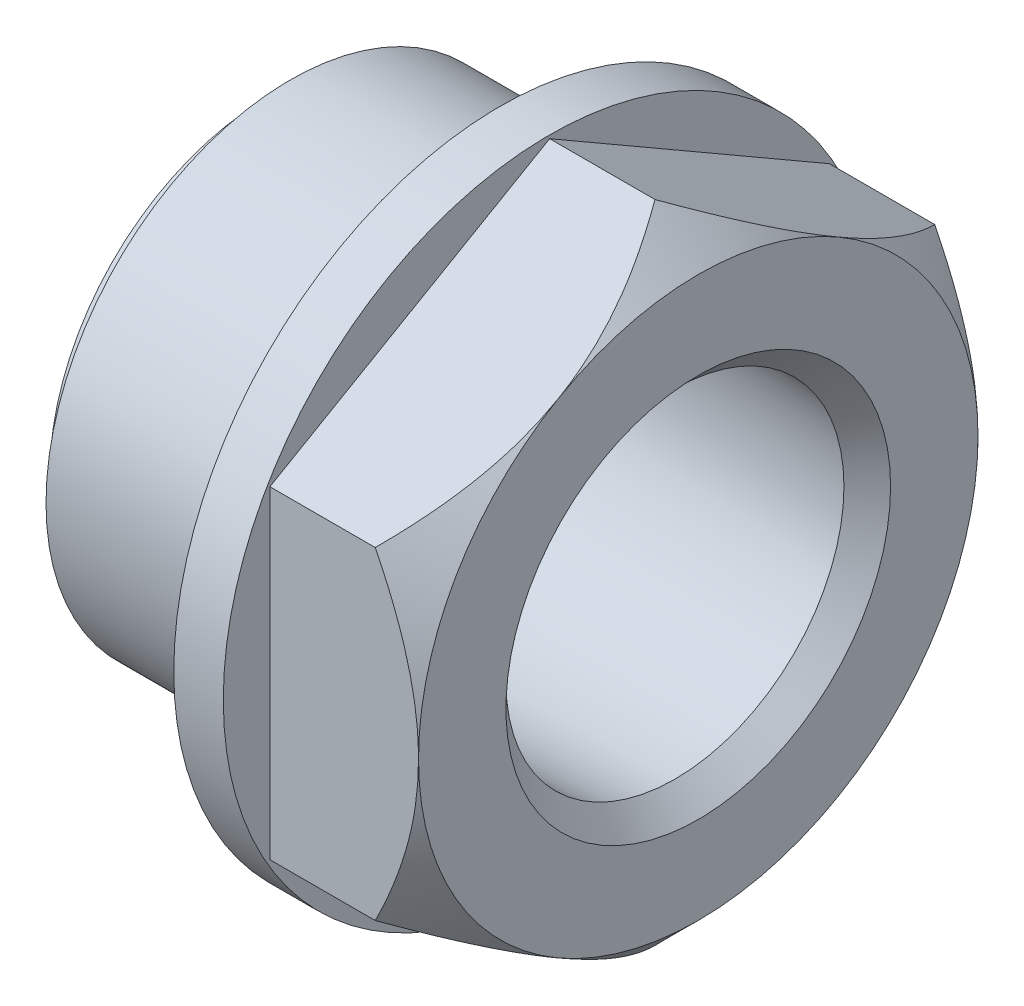
ISO-10303-21;
HEADER;
FILE_DESCRIPTION(('STEP AP214'),'2;1');
FILE_NAME('part.step','',(''),(''),'','','');
FILE_SCHEMA(('AUTOMOTIVE_DESIGN { 1 0 10303 214 1 1 1 1 }'));
ENDSEC;
DATA;
#1=APPLICATION_CONTEXT('core data for automotive mechanical design processes');
#2=APPLICATION_PROTOCOL_DEFINITION('international standard','automotive_design',2000,#1);
#3=PRODUCT_CONTEXT('',#1,'mechanical');
#4=PRODUCT('Part','Part','',(#3));
#5=PRODUCT_RELATED_PRODUCT_CATEGORY('part','',(#4));
#6=PRODUCT_DEFINITION_FORMATION('','',#4);
#7=PRODUCT_DEFINITION_CONTEXT('part definition',#1,'design');
#8=PRODUCT_DEFINITION('design','',#6,#7);
#9=PRODUCT_DEFINITION_SHAPE('','',#8);
#10=(LENGTH_UNIT() NAMED_UNIT(*) SI_UNIT(.MILLI.,.METRE.));
#11=(NAMED_UNIT(*) PLANE_ANGLE_UNIT() SI_UNIT($,.RADIAN.));
#12=(NAMED_UNIT(*) SI_UNIT($,.STERADIAN.) SOLID_ANGLE_UNIT());
#13=UNCERTAINTY_MEASURE_WITH_UNIT(LENGTH_MEASURE(1.E-05),#10,'distance_accuracy_value','');
#14=(GEOMETRIC_REPRESENTATION_CONTEXT(3) GLOBAL_UNCERTAINTY_ASSIGNED_CONTEXT((#13)) GLOBAL_UNIT_ASSIGNED_CONTEXT((#10,
#11,#12)) REPRESENTATION_CONTEXT('',''));
#15=CARTESIAN_POINT('',(0.,0.,0.));
#16=DIRECTION('',(0.,0.,1.));
#17=DIRECTION('',(1.,0.,0.));
#18=AXIS2_PLACEMENT_3D('',#15,#16,#17);
#19=CARTESIAN_POINT('',(10.,13.146,0.));
#20=DIRECTION('',(-1.,0.,0.));
#21=DIRECTION('',(0.,0.,1.));
#22=AXIS2_PLACEMENT_3D('',#19,#20,#21);
#23=PLANE('',#22);
#24=CARTESIAN_POINT('',(10.,0.,0.));
#25=DIRECTION('',(-1.,0.,0.));
#26=DIRECTION('',(0.,0.,1.));
#27=AXIS2_PLACEMENT_3D('',#24,#25,#26);
#28=CIRCLE('',#27,12.292);
#29=CARTESIAN_POINT('',(10.,0.,12.292));
#30=VERTEX_POINT('',#29);
#31=EDGE_CURVE('E378',#30,#30,#28,.T.);
#32=ORIENTED_EDGE('',*,*,#31,.F.);
#33=EDGE_LOOP('',(#32));
#34=FACE_BOUND('',#33,.T.);
#35=CARTESIAN_POINT('',(10.,0.,0.));
#36=DIRECTION('',(-1.,0.,0.));
#37=DIRECTION('',(0.,0.,1.));
#38=AXIS2_PLACEMENT_3D('',#35,#36,#37);
#39=CIRCLE('',#38,14.);
#40=CARTESIAN_POINT('',(10.,0.,14.));
#41=VERTEX_POINT('',#40);
#42=EDGE_CURVE('E19',#41,#41,#39,.F.);
#43=ORIENTED_EDGE('',*,*,#42,.F.);
#44=EDGE_LOOP('',(#43));
#45=FACE_BOUND('',#44,.T.);
#46=ADVANCED_FACE('F16',(#34,#45),#23,.T.);
#47=CARTESIAN_POINT('',(13.25,0.,0.));
#48=DIRECTION('',(-1.,0.,0.));
#49=DIRECTION('',(0.,0.,1.));
#50=AXIS2_PLACEMENT_3D('',#47,#48,#49);
#51=CYLINDRICAL_SURFACE('',#50,14.);
#52=CARTESIAN_POINT('',(12.125,0.,0.));
#53=DIRECTION('',(-1.,0.,0.));
#54=DIRECTION('',(0.,0.,1.));
#55=AXIS2_PLACEMENT_3D('',#52,#53,#54);
#56=CIRCLE('',#55,14.);
#57=CARTESIAN_POINT('',(12.125,0.,14.));
#58=VERTEX_POINT('',#57);
#59=EDGE_CURVE('E376',#58,#58,#56,.F.);
#60=ORIENTED_EDGE('',*,*,#59,.F.);
#61=EDGE_LOOP('',(#60));
#62=FACE_BOUND('',#61,.T.);
#63=ORIENTED_EDGE('',*,*,#42,.T.);
#64=EDGE_LOOP('',(#63));
#65=FACE_BOUND('',#64,.T.);
#66=ADVANCED_FACE('F318',(#62,#65),#51,.T.);
#67=CARTESIAN_POINT('',(9.5,0.,0.));
#68=DIRECTION('',(-1.,0.,0.));
#69=DIRECTION('',(0.,0.,1.));
#70=AXIS2_PLACEMENT_3D('',#67,#68,#69);
#71=CYLINDRICAL_SURFACE('',#70,12.292);
#72=ORIENTED_EDGE('',*,*,#31,.T.);
#73=EDGE_LOOP('',(#72));
#74=FACE_BOUND('',#73,.T.);
#75=CARTESIAN_POINT('',(9.,0.,0.));
#76=DIRECTION('',(-1.,0.,0.));
#77=DIRECTION('',(0.,0.,1.));
#78=AXIS2_PLACEMENT_3D('',#75,#76,#77);
#79=CIRCLE('',#78,12.292);
#80=CARTESIAN_POINT('',(9.,0.,12.292));
#81=VERTEX_POINT('',#80);
#82=EDGE_CURVE('E146',#81,#81,#79,.T.);
#83=ORIENTED_EDGE('',*,*,#82,.F.);
#84=EDGE_LOOP('',(#83));
#85=FACE_BOUND('',#84,.T.);
#86=ADVANCED_FACE('F316',(#74,#85),#71,.T.);
#87=CARTESIAN_POINT('',(12.125,0.,0.));
#88=DIRECTION('',(1.,0.,0.));
#89=DIRECTION('',(0.,0.,-1.));
#90=AXIS2_PLACEMENT_3D('',#87,#88,#89);
#91=PLANE('',#90);
#92=DIRECTION('',(0.,1.,0.));
#93=VECTOR('',#92,1.);
#94=CARTESIAN_POINT('',(12.125,-6.92820323027551,12.));
#95=LINE('',#94,#93);
#96=CARTESIAN_POINT('',(12.125,-6.92820323027548,12.));
#97=VERTEX_POINT('',#96);
#98=CARTESIAN_POINT('',(12.125,6.92820323027551,12.));
#99=VERTEX_POINT('',#98);
#100=EDGE_CURVE('E135',#97,#99,#95,.T.);
#101=ORIENTED_EDGE('',*,*,#100,.T.);
#102=DIRECTION('',(0.,0.5,-0.866025403784439));
#103=VECTOR('',#102,1.);
#104=CARTESIAN_POINT('',(12.125,6.92820323027551,12.));
#105=LINE('',#104,#103);
#106=CARTESIAN_POINT('',(12.125,13.856406460551,0.));
#107=VERTEX_POINT('',#106);
#108=EDGE_CURVE('E102',#99,#107,#105,.T.);
#109=ORIENTED_EDGE('',*,*,#108,.T.);
#110=DIRECTION('',(0.,-0.500000000000001,-0.866025403784438));
#111=VECTOR('',#110,1.);
#112=CARTESIAN_POINT('',(12.125,14.4337567297407,1.));
#113=LINE('',#112,#111);
#114=CARTESIAN_POINT('',(12.125,6.92820323027551,-12.));
#115=VERTEX_POINT('',#114);
#116=EDGE_CURVE('E96',#107,#115,#113,.T.);
#117=ORIENTED_EDGE('',*,*,#116,.T.);
#118=DIRECTION('',(0.,1.,0.));
#119=VECTOR('',#118,1.);
#120=CARTESIAN_POINT('',(12.125,6.9282032302755,-12.));
#121=LINE('',#120,#119);
#122=CARTESIAN_POINT('',(12.125,-6.9282032302755,-12.));
#123=VERTEX_POINT('',#122);
#124=EDGE_CURVE('E101',#115,#123,#121,.F.);
#125=ORIENTED_EDGE('',*,*,#124,.T.);
#126=DIRECTION('',(0.,-0.5,0.866025403784439));
#127=VECTOR('',#126,1.);
#128=CARTESIAN_POINT('',(12.125,-6.9282032302755,-12.));
#129=LINE('',#128,#127);
#130=CARTESIAN_POINT('',(12.125,-13.856406460551,0.));
#131=VERTEX_POINT('',#130);
#132=EDGE_CURVE('E125',#123,#131,#129,.T.);
#133=ORIENTED_EDGE('',*,*,#132,.T.);
#134=DIRECTION('',(0.,0.5,0.866025403784439));
#135=VECTOR('',#134,1.);
#136=CARTESIAN_POINT('',(12.125,-14.4337567297406,-1.));
#137=LINE('',#136,#135);
#138=EDGE_CURVE('E130',#131,#97,#137,.T.);
#139=ORIENTED_EDGE('',*,*,#138,.T.);
#140=EDGE_LOOP('',(#101,#109,#117,#125,#133,#139));
#141=FACE_BOUND('',#140,.T.);
#142=ORIENTED_EDGE('',*,*,#59,.T.);
#143=EDGE_LOOP('',(#142));
#144=FACE_BOUND('',#143,.T.);
#145=ADVANCED_FACE('F98',(#141,#144),#91,.T.);
#146=CARTESIAN_POINT('',(9.,11.386,0.));
#147=DIRECTION('',(-1.,0.,0.));
#148=DIRECTION('',(0.,0.,1.));
#149=AXIS2_PLACEMENT_3D('',#146,#147,#148);
#150=PLANE('',#149);
#151=CARTESIAN_POINT('',(9.,0.,0.));
#152=DIRECTION('',(-1.,0.,0.));
#153=DIRECTION('',(0.,0.,1.));
#154=AXIS2_PLACEMENT_3D('',#151,#152,#153);
#155=CIRCLE('',#154,10.48);
#156=CARTESIAN_POINT('',(9.,0.,10.48));
#157=VERTEX_POINT('',#156);
#158=EDGE_CURVE('E364',#157,#157,#155,.T.);
#159=ORIENTED_EDGE('',*,*,#158,.F.);
#160=EDGE_LOOP('',(#159));
#161=FACE_BOUND('',#160,.T.);
#162=ORIENTED_EDGE('',*,*,#82,.T.);
#163=EDGE_LOOP('',(#162));
#164=FACE_BOUND('',#163,.T.);
#165=ADVANCED_FACE('F308',(#161,#164),#150,.T.);
#166=CARTESIAN_POINT('',(24.875,6.92820323027551,12.));
#167=DIRECTION('',(0.,-0.866025403784439,-0.5));
#168=DIRECTION('',(0.,0.5,-0.866025403784439));
#169=AXIS2_PLACEMENT_3D('',#166,#167,#168);
#170=PLANE('',#169);
#171=ORIENTED_EDGE('',*,*,#108,.F.);
#172=DIRECTION('',(-1.,0.,0.));
#173=VECTOR('',#172,1.);
#174=CARTESIAN_POINT('',(24.875,6.92820323027551,12.));
#175=LINE('',#174,#173);
#176=CARTESIAN_POINT('',(16.6435935359117,6.92820322673824,12.0000000061267));
#177=VERTEX_POINT('',#176);
#178=EDGE_CURVE('E133',#99,#177,#175,.F.);
#179=ORIENTED_EDGE('',*,*,#178,.T.);
#180=CARTESIAN_POINT('',(18.5,10.3923048454133,5.99999999999998));
#181=CARTESIAN_POINT('',(18.5000214012147,10.3001580482508,6.15960293444011));
#182=CARTESIAN_POINT('',(18.4957550520564,10.2080149027244,6.31919954406104));
#183=CARTESIAN_POINT('',(18.4788058166658,10.0239363279119,6.63803298822126));
#184=CARTESIAN_POINT('',(18.4661242544,9.93200086823313,6.79726987540201));
#185=CARTESIAN_POINT('',(18.4325329546137,9.74866992467553,7.11480838424332));
#186=CARTESIAN_POINT('',(18.4116376909631,9.65727377645075,7.27311115658474));
#187=CARTESIAN_POINT('',(18.3619199018999,9.47502603821456,7.58877349877432));
#188=CARTESIAN_POINT('',(18.3330971567225,9.38417446337112,7.74613304235081));
#189=CARTESIAN_POINT('',(18.2362673040509,9.11539646301031,8.2116701949325));
#190=CARTESIAN_POINT('',(18.1573597256669,8.93843123531564,8.51818296047266));
#191=CARTESIAN_POINT('',(17.9736695418297,8.58789265376202,9.12533359373665));
#192=CARTESIAN_POINT('',(17.8688788326135,8.41432038060701,9.42596958962637));
#193=CARTESIAN_POINT('',(17.6773863708097,8.13044417336836,9.91765760362367));
#194=CARTESIAN_POINT('',(17.5969985929983,8.01905764515047,10.1105847297758));
#195=CARTESIAN_POINT('',(17.4278289845295,7.79791723652669,10.4936111531187));
#196=CARTESIAN_POINT('',(17.3390489243437,7.68816301739123,10.6837110370063));
#197=CARTESIAN_POINT('',(17.1530787276864,7.46911823894365,11.0631077224102));
#198=CARTESIAN_POINT('',(17.0558111215107,7.35984420893125,11.2523758943395));
#199=CARTESIAN_POINT('',(16.8545394181464,7.14286473622993,11.6281953652577));
#200=CARTESIAN_POINT('',(16.7505357696065,7.03515918965747,11.8147468441782));
#201=CARTESIAN_POINT('',(16.6435935333097,6.92820322413621,12.0000000106336));
#202=B_SPLINE_CURVE_WITH_KNOTS('',3,(#180,#181,#182,#183,#184,#185,#186,#187,#188,#189,#190,
#191,#192,#193,#194,#195,#196,#197,#198,#199,#200,#201),.UNSPECIFIED.,.F.,.F.,(4,2,2,2,2,2,2,2,
2,2,4),(0.,0.552819302485784,1.10555165045821,1.65731432981182,2.20909230661315,
3.29573306208976,4.38271446670579,5.09304904233947,5.80323409578149,6.52076262349193,
7.23824340983378),.UNSPECIFIED.);
#203=CARTESIAN_POINT('',(18.5,10.3923048454133,5.99999999999999));
#204=VERTEX_POINT('',#203);
#205=EDGE_CURVE('E262',#204,#177,#202,.T.);
#206=ORIENTED_EDGE('',*,*,#205,.F.);
#207=CARTESIAN_POINT('',(16.643593518941,13.8564064377386,-2.17519626082027E-08));
#208=CARTESIAN_POINT('',(16.7634443813126,13.7365345526683,0.207624212841111));
#209=CARTESIAN_POINT('',(16.8796150892258,13.6157176463444,0.416885249118554));
#210=CARTESIAN_POINT('',(17.1034212288145,13.3720429935528,0.838942140075366));
#211=CARTESIAN_POINT('',(17.2110517116932,13.2491841129759,1.0517399590779));
#212=CARTESIAN_POINT('',(17.4171049957558,13.0006364623115,1.48223711494745));
#213=CARTESIAN_POINT('',(17.5154658994841,12.8749347868178,1.6999588046682));
#214=CARTESIAN_POINT('',(17.7007499981217,12.6214559537171,2.13899702309646));
#215=CARTESIAN_POINT('',(17.7876752252215,12.4936791694162,2.36031290521922));
#216=CARTESIAN_POINT('',(17.9462537780236,12.239803596543,2.80003829601357));
#217=CARTESIAN_POINT('',(18.0182750128793,12.1137625632583,3.01834776958145));
#218=CARTESIAN_POINT('',(18.1486623778504,11.8599300114785,3.45799864593772));
#219=CARTESIAN_POINT('',(18.2070300881805,11.7321386973692,3.67933969471948));
#220=CARTESIAN_POINT('',(18.308634703979,11.4754170878705,4.1239945657564));
#221=CARTESIAN_POINT('',(18.3519126802403,11.3464908789797,4.34730130998816));
#222=CARTESIAN_POINT('',(18.4224240056902,11.0875704661716,4.79576462009273));
#223=CARTESIAN_POINT('',(18.4496624834315,10.9575766171215,5.02092057131725));
#224=CARTESIAN_POINT('',(18.4789525109781,10.75506120507,5.37168755430549));
#225=CARTESIAN_POINT('',(18.4868188774119,10.6827399677421,5.49695161182387));
#226=CARTESIAN_POINT('',(18.4973561715047,10.5377162176319,5.74814011531919));
#227=CARTESIAN_POINT('',(18.5000063965541,10.4650133293052,5.87406521175815));
#228=CARTESIAN_POINT('',(18.5,10.3923048454133,5.99999999999998));
#229=B_SPLINE_CURVE_WITH_KNOTS('',3,(#207,#208,#209,#210,#211,#212,#213,#214,#215,#216,#217,
#218,#219,#220,#221,#222,#223,#224,#225,#226,#227,#228),.UNSPECIFIED.,.F.,.F.,(4,2,2,2,2,2,2,2,
2,2,4),(0.,0.804132064481402,1.60872674645307,2.41836120867867,3.22785159893361,
4.01401465428508,4.80008667660401,5.58400217660222,6.36766688707782,6.8021509964881,
7.23835610217239),.UNSPECIFIED.);
#230=CARTESIAN_POINT('',(16.6435935571344,13.8564064428656,-3.06321939377383E-08));
#231=VERTEX_POINT('',#230);
#232=EDGE_CURVE('E292',#231,#204,#229,.T.);
#233=ORIENTED_EDGE('',*,*,#232,.F.);
#234=DIRECTION('',(1.,0.,0.));
#235=VECTOR('',#234,1.);
#236=CARTESIAN_POINT('',(24.875,13.856406460551,0.));
#237=LINE('',#236,#235);
#238=EDGE_CURVE('E106',#231,#107,#237,.F.);
#239=ORIENTED_EDGE('',*,*,#238,.T.);
#240=EDGE_LOOP('',(#171,#179,#206,#233,#239));
#241=FACE_BOUND('',#240,.T.);
#242=ADVANCED_FACE('F304',(#241),#170,.F.);
#243=CARTESIAN_POINT('',(24.875,-6.92820323027551,12.));
#244=DIRECTION('',(0.,0.,-1.));
#245=DIRECTION('',(-1.,0.,0.));
#246=AXIS2_PLACEMENT_3D('',#243,#244,#245);
#247=PLANE('',#246);
#248=CARTESIAN_POINT('',(16.6435935748203,6.9282031595329,12.));
#249=CARTESIAN_POINT('',(16.7634444263458,6.68845935337836,12.));
#250=CARTESIAN_POINT('',(16.8796151285448,6.44682552723826,12.));
#251=CARTESIAN_POINT('',(17.1034212613102,5.95947621450836,12.));
#252=CARTESIAN_POINT('',(17.2110517430797,5.7137584597102,12.));
#253=CARTESIAN_POINT('',(17.4171050238102,5.21666316581342,12.));
#254=CARTESIAN_POINT('',(17.5154659253059,4.96525981586815,12.));
#255=CARTESIAN_POINT('',(17.7007500198982,4.45830215331546,12.));
#256=CARTESIAN_POINT('',(17.7876752451868,4.20274858732039,12.));
#257=CARTESIAN_POINT('',(17.9462537945568,3.69499744617505,12.));
#258=CARTESIAN_POINT('',(18.0182750277774,3.44291538160406,12.));
#259=CARTESIAN_POINT('',(18.1486623896603,2.93525028223017,12.));
#260=CARTESIAN_POINT('',(18.207030098537,2.67966765619882,12.));
#261=CARTESIAN_POINT('',(18.3086347116278,2.16622444165359,12.));
#262=CARTESIAN_POINT('',(18.3519126866352,1.90837202613705,12.));
#263=CARTESIAN_POINT('',(18.4224240098301,1.39053120514956,12.));
#264=CARTESIAN_POINT('',(18.449662486571,1.13054350941333,12.));
#265=CARTESIAN_POINT('',(18.4789525125091,0.725512692919886,12.));
#266=CARTESIAN_POINT('',(18.4868188783724,0.580870223497004,12.));
#267=CARTESIAN_POINT('',(18.4973561716977,0.290822733818333,12.));
#268=CARTESIAN_POINT('',(18.5000063965529,0.145416962473827,12.));
#269=CARTESIAN_POINT('',(18.5,0.,12.));
#270=B_SPLINE_CURVE_WITH_KNOTS('',3,(#248,#249,#250,#251,#252,#253,#254,#255,#256,#257,#258,
#259,#260,#261,#262,#263,#264,#265,#266,#267,#268,#269),.UNSPECIFIED.,.F.,.F.,(4,2,2,2,2,2,2,2,
2,2,4),(0.,0.804132055819267,1.60872672937668,2.41836118335988,3.22785156526581,
4.01401461329934,4.80008662831576,5.58400212098438,6.36766682411132,6.80215091776213,
7.23835600752121),.UNSPECIFIED.);
#271=CARTESIAN_POINT('',(18.5,0.,12.));
#272=VERTEX_POINT('',#271);
#273=EDGE_CURVE('E286',#177,#272,#270,.T.);
#274=ORIENTED_EDGE('',*,*,#273,.F.);
#275=ORIENTED_EDGE('',*,*,#178,.F.);
#276=ORIENTED_EDGE('',*,*,#100,.F.);
#277=DIRECTION('',(1.,0.,0.));
#278=VECTOR('',#277,1.);
#279=CARTESIAN_POINT('',(24.875,-6.92820323027548,12.));
#280=LINE('',#279,#278);
#281=CARTESIAN_POINT('',(16.6435935359117,-6.92820323735002,12.));
#282=VERTEX_POINT('',#281);
#283=EDGE_CURVE('E128',#97,#282,#280,.T.);
#284=ORIENTED_EDGE('',*,*,#283,.T.);
#285=CARTESIAN_POINT('',(18.5,0.,12.));
#286=CARTESIAN_POINT('',(18.5000214012147,-0.184293594325128,12.));
#287=CARTESIAN_POINT('',(18.4957550520564,-0.368579885378118,12.));
#288=CARTESIAN_POINT('',(18.4788058166658,-0.736737035003639,12.));
#289=CARTESIAN_POINT('',(18.4661242543999,-0.920607954361286,12.));
#290=CARTESIAN_POINT('',(18.4325329546136,-1.28726984147684,12.));
#291=CARTESIAN_POINT('',(18.4116376909629,-1.47006213792657,12.));
#292=CARTESIAN_POINT('',(18.3619199018996,-1.83455761439924,12.));
#293=CARTESIAN_POINT('',(18.3330971567221,-2.01626076408628,12.));
#294=CARTESIAN_POINT('',(18.2362673040505,-2.55381676480765,12.));
#295=CARTESIAN_POINT('',(18.1573597256666,-2.9077472201966,12.));
#296=CARTESIAN_POINT('',(17.9736695418295,-3.60882438330312,12.));
#297=CARTESIAN_POINT('',(17.8688788326134,-3.95596892961282,12.));
#298=CARTESIAN_POINT('',(17.6773863707546,-4.52372134425315,12.));
#299=CARTESIAN_POINT('',(17.5969985928813,-4.74649440084991,12.));
#300=CARTESIAN_POINT('',(17.427828984277,-5.18877521841475,12.));
#301=CARTESIAN_POINT('',(17.3390489240178,-5.40828365684198,12.));
#302=CARTESIAN_POINT('',(17.1530787272024,-5.84637321404879,12.));
#303=CARTESIAN_POINT('',(17.0558111209419,-6.06492127422886,12.));
#304=CARTESIAN_POINT('',(16.8545394174,-6.49888021993755,12.));
#305=CARTESIAN_POINT('',(16.7505357687673,-6.71429131323325,12.));
#306=CARTESIAN_POINT('',(16.6435935323745,-6.92820324442457,12.));
#307=B_SPLINE_CURVE_WITH_KNOTS('',3,(#285,#286,#287,#288,#289,#290,#291,#292,#293,#294,#295,
#296,#297,#298,#299,#300,#301,#302,#303,#304,#305,#306),.UNSPECIFIED.,.F.,.F.,(4,2,2,2,2,2,2,2,
2,2,4),(0.,0.552819302486391,1.10555165045942,1.65731432981351,2.20909230661531,
3.29573306209073,4.3827144667058,5.09304904285643,5.80323409681548,6.52076262505471,
7.23824341192472),.UNSPECIFIED.);
#308=EDGE_CURVE('E261',#272,#282,#307,.T.);
#309=ORIENTED_EDGE('',*,*,#308,.F.);
#310=EDGE_LOOP('',(#274,#275,#276,#284,#309));
#311=FACE_BOUND('',#310,.T.);
#312=ADVANCED_FACE('F248',(#311),#247,.F.);
#313=CARTESIAN_POINT('',(24.875,-14.4337567297406,-1.));
#314=DIRECTION('',(0.,0.866025403784439,-0.5));
#315=DIRECTION('',(0.,0.5,0.866025403784439));
#316=AXIS2_PLACEMENT_3D('',#313,#314,#315);
#317=PLANE('',#316);
#318=CARTESIAN_POINT('',(18.5,-10.3923048454132,5.99999999999996));
#319=CARTESIAN_POINT('',(18.5000214012147,-10.4844516425758,5.84039706555966));
#320=CARTESIAN_POINT('',(18.4957550520565,-10.5765947881023,5.68080045593855));
#321=CARTESIAN_POINT('',(18.4788058166658,-10.7606733629151,5.36196701177799));
#322=CARTESIAN_POINT('',(18.4661242543999,-10.8526088225939,5.20273012459706));
#323=CARTESIAN_POINT('',(18.4325329546136,-11.0359397661517,4.88519161575545));
#324=CARTESIAN_POINT('',(18.411637690963,-11.1273359143765,4.72688884341389));
#325=CARTESIAN_POINT('',(18.3619199018996,-11.3095836526129,4.41122650122404));
#326=CARTESIAN_POINT('',(18.3330971567222,-11.4004352274564,4.25386695764742));
#327=CARTESIAN_POINT('',(18.2362673040505,-11.6692132278171,3.78832980506595));
#328=CARTESIAN_POINT('',(18.1573597256666,-11.8461784555115,3.48181703952612));
#329=CARTESIAN_POINT('',(17.9736695418296,-12.1967170370648,2.87466640626276));
#330=CARTESIAN_POINT('',(17.8688788326134,-12.3702893102197,2.57403041037333));
#331=CARTESIAN_POINT('',(17.6773863707547,-12.6541655175398,2.08234239623485));
#332=CARTESIAN_POINT('',(17.5969985928813,-12.7655520458382,1.88941526994334));
#333=CARTESIAN_POINT('',(17.4278289842771,-12.9866924546206,1.50638884632564));
#334=CARTESIAN_POINT('',(17.3390489240179,-13.0964466738342,1.31628896230261));
#335=CARTESIAN_POINT('',(17.1530787272024,-13.3154914524376,0.936892276628837));
#336=CARTESIAN_POINT('',(17.0558111209419,-13.4247654825277,0.747624104565091));
#337=CARTESIAN_POINT('',(16.8545394174,-13.641744955382,0.371804633381848));
#338=CARTESIAN_POINT('',(16.7505357687673,-13.7494505020299,0.185253154330798));
#339=CARTESIAN_POINT('',(16.6435935323745,-13.8564064676255,-1.22534716911657E-08));
#340=B_SPLINE_CURVE_WITH_KNOTS('',3,(#318,#319,#320,#321,#322,#323,#324,#325,#326,#327,#328,
#329,#330,#331,#332,#333,#334,#335,#336,#337,#338,#339),.UNSPECIFIED.,.F.,.F.,(4,2,2,2,2,2,2,2,
2,2,4),(0.,0.55281930248639,1.10555165045942,1.65731432981351,2.20909230661531,3.29573306209073,
4.38271446670579,5.09304904285642,5.80323409681547,6.52076262505469,7.23824341192471),.UNSPECIFIED.);
#341=CARTESIAN_POINT('',(18.5,-10.3923048454133,5.99999999999997));
#342=VERTEX_POINT('',#341);
#343=CARTESIAN_POINT('',(16.6435935359117,-13.8564064640883,-6.12673527107802E-09));
#344=VERTEX_POINT('',#343);
#345=EDGE_CURVE('E229',#342,#344,#340,.T.);
#346=ORIENTED_EDGE('',*,*,#345,.F.);
#347=CARTESIAN_POINT('',(16.6435935748203,-6.92820326564678,11.9999999387351));
#348=CARTESIAN_POINT('',(16.7634444263458,-7.04807516872405,11.7923757122053));
#349=CARTESIAN_POINT('',(16.8796151285449,-7.1688920817941,11.5831146803543));
#350=CARTESIAN_POINT('',(17.1034212613103,-7.41256673815905,11.1610577950133));
#351=CARTESIAN_POINT('',(17.2110517430797,-7.53542561555813,10.9482599771973));
#352=CARTESIAN_POINT('',(17.4171050238102,-7.78397326250652,10.517762824581));
#353=CARTESIAN_POINT('',(17.5154659253059,-7.90967493747916,10.3000411369318));
#354=CARTESIAN_POINT('',(17.7007500198982,-8.1631537687555,9.86100292251803));
#355=CARTESIAN_POINT('',(17.7876752451869,-8.29093055175303,9.63968704233861));
#356=CARTESIAN_POINT('',(17.9462537945568,-8.54480612232571,9.1999616553062));
#357=CARTESIAN_POINT('',(18.0182750277774,-8.6708471546112,8.9816521835493));
#358=CARTESIAN_POINT('',(18.1486623896604,-8.92467970429815,8.54200131087675));
#359=CARTESIAN_POINT('',(18.2070300985371,-9.05247101731382,8.32066026396766));
#360=CARTESIAN_POINT('',(18.3086347116279,-9.30919262458644,7.87600539677075));
#361=CARTESIAN_POINT('',(18.3519126866352,-9.43811883234471,7.65269865450625));
#362=CARTESIAN_POINT('',(18.4224240098302,-9.69703924283846,7.20423534841449));
#363=CARTESIAN_POINT('',(18.449662486571,-9.82703309070657,6.97907939923554));
#364=CARTESIAN_POINT('',(18.4789525125092,-10.0295484989533,6.62831242283665));
#365=CARTESIAN_POINT('',(18.4868188783724,-10.1018697336647,6.50304836985032));
#366=CARTESIAN_POINT('',(18.4973561716977,-10.2468934785041,6.25185987548468));
#367=CARTESIAN_POINT('',(18.500006396553,-10.3195963641763,6.12593478364347));
#368=CARTESIAN_POINT('',(18.5,-10.3923048454132,5.99999999999996));
#369=B_SPLINE_CURVE_WITH_KNOTS('',3,(#347,#348,#349,#350,#351,#352,#353,#354,#355,#356,#357,
#358,#359,#360,#361,#362,#363,#364,#365,#366,#367,#368),.UNSPECIFIED.,.F.,.F.,(4,2,2,2,2,2,2,2,
2,2,4),(0.,0.804132055819271,1.60872672937668,2.41836118335989,3.22785156526582,
4.01401461329935,4.80008662831578,5.58400212098439,6.36766682411134,6.80215091776216,
7.23835600752125),.UNSPECIFIED.);
#370=EDGE_CURVE('E255',#282,#342,#369,.T.);
#371=ORIENTED_EDGE('',*,*,#370,.F.);
#372=ORIENTED_EDGE('',*,*,#283,.F.);
#373=ORIENTED_EDGE('',*,*,#138,.F.);
#374=DIRECTION('',(1.,0.,0.));
#375=VECTOR('',#374,1.);
#376=CARTESIAN_POINT('',(24.875,-13.856406460551,0.));
#377=LINE('',#376,#375);
#378=EDGE_CURVE('E121',#131,#344,#377,.T.);
#379=ORIENTED_EDGE('',*,*,#378,.T.);
#380=EDGE_LOOP('',(#346,#371,#372,#373,#379));
#381=FACE_BOUND('',#380,.T.);
#382=ADVANCED_FACE('F243',(#381),#317,.F.);
#383=CARTESIAN_POINT('',(24.875,-6.9282032302755,-12.));
#384=DIRECTION('',(0.,0.866025403784439,0.5));
#385=DIRECTION('',(0.,-0.5,0.866025403784439));
#386=AXIS2_PLACEMENT_3D('',#383,#384,#385);
#387=PLANE('',#386);
#388=CARTESIAN_POINT('',(16.6435935748203,-13.8564064251797,-6.12648886899775E-08));
#389=CARTESIAN_POINT('',(16.7634444263458,-13.7365345221024,-0.207624287794692));
#390=CARTESIAN_POINT('',(16.8796151285449,-13.6157176090324,-0.416885319645657));
#391=CARTESIAN_POINT('',(17.1034212613102,-13.3720429526674,-0.838942204986638));
#392=CARTESIAN_POINT('',(17.2110517430797,-13.2491840752684,-1.05174002280272));
#393=CARTESIAN_POINT('',(17.4171050238102,-13.00063642832,-1.48223717541902));
#394=CARTESIAN_POINT('',(17.5154659253059,-12.8749347533473,-1.69995886306813));
#395=CARTESIAN_POINT('',(17.7007500198982,-12.621455922071,-2.13899707748195));
#396=CARTESIAN_POINT('',(17.7876752451868,-12.4936791390735,-2.36031295766137));
#397=CARTESIAN_POINT('',(17.9462537945568,-12.2398035685008,-2.80003834469378));
#398=CARTESIAN_POINT('',(18.0182750277774,-12.1137625362153,-3.01834781645068));
#399=CARTESIAN_POINT('',(18.1486623896603,-11.8599299865283,-3.45799868912323));
#400=CARTESIAN_POINT('',(18.207030098537,-11.7321386735127,-3.67933973603231));
#401=CARTESIAN_POINT('',(18.3086347116278,-11.4754170662401,-4.12399460322922));
#402=CARTESIAN_POINT('',(18.3519126866352,-11.3464908584818,-4.34730134549373));
#403=CARTESIAN_POINT('',(18.4224240098301,-11.087570447988,-4.79576465158549));
#404=CARTESIAN_POINT('',(18.449662486571,-10.9575766001199,-5.02092060076444));
#405=CARTESIAN_POINT('',(18.4789525125091,-10.7550611918732,-5.37168757716331));
#406=CARTESIAN_POINT('',(18.4868188783724,-10.6827399571618,-5.49695163014964));
#407=CARTESIAN_POINT('',(18.4973561716977,-10.5377162123224,-5.74814012451527));
#408=CARTESIAN_POINT('',(18.5000063965529,-10.4650133266502,-5.87406521635648));
#409=CARTESIAN_POINT('',(18.5,-10.3923048454133,-5.99999999999998));
#410=B_SPLINE_CURVE_WITH_KNOTS('',3,(#388,#389,#390,#391,#392,#393,#394,#395,#396,#397,#398,
#399,#400,#401,#402,#403,#404,#405,#406,#407,#408,#409),.UNSPECIFIED.,.F.,.F.,(4,2,2,2,2,2,2,2,
2,2,4),(0.,0.80413205581927,1.60872672937668,2.41836118335988,3.22785156526581,4.01401461329934,
4.80008662831576,5.58400212098438,6.36766682411133,6.80215091776212,7.23835600752119),.UNSPECIFIED.);
#411=CARTESIAN_POINT('',(18.5,-10.3923048454133,-5.99999999999999));
#412=VERTEX_POINT('',#411);
#413=EDGE_CURVE('E237',#344,#412,#410,.T.);
#414=ORIENTED_EDGE('',*,*,#413,.F.);
#415=ORIENTED_EDGE('',*,*,#378,.F.);
#416=ORIENTED_EDGE('',*,*,#132,.F.);
#417=DIRECTION('',(1.,0.,0.));
#418=VECTOR('',#417,1.);
#419=CARTESIAN_POINT('',(24.875,-6.9282032302755,-12.));
#420=LINE('',#419,#418);
#421=CARTESIAN_POINT('',(16.6435935359117,-6.92820322673823,-12.0000000061267));
#422=VERTEX_POINT('',#421);
#423=EDGE_CURVE('E110',#123,#422,#420,.T.);
#424=ORIENTED_EDGE('',*,*,#423,.T.);
#425=CARTESIAN_POINT('',(18.5,-10.3923048454133,-5.99999999999998));
#426=CARTESIAN_POINT('',(18.5000214012147,-10.3001580482508,-6.15960293444011));
#427=CARTESIAN_POINT('',(18.4957550520565,-10.2080149027244,-6.31919954406103));
#428=CARTESIAN_POINT('',(18.4788058166659,-10.0239363279118,-6.63803298822125));
#429=CARTESIAN_POINT('',(18.4661242544,-9.93200086823313,-6.797269875402));
#430=CARTESIAN_POINT('',(18.4325329546137,-9.74866992467553,-7.11480838424331));
#431=CARTESIAN_POINT('',(18.4116376909631,-9.65727377645074,-7.27311115658473));
#432=CARTESIAN_POINT('',(18.3619199018999,-9.47502603821456,-7.58877349877431));
#433=CARTESIAN_POINT('',(18.3330971567225,-9.38417446337112,-7.7461330423508));
#434=CARTESIAN_POINT('',(18.2362673040509,-9.11539646301031,-8.21167019493249));
#435=CARTESIAN_POINT('',(18.1573597256669,-8.93843123531564,-8.51818296047266));
#436=CARTESIAN_POINT('',(17.9736695418297,-8.58789265376202,-9.12533359373665));
#437=CARTESIAN_POINT('',(17.8688788326135,-8.414320380607,-9.42596958962636));
#438=CARTESIAN_POINT('',(17.6773863708097,-8.13044417336835,-9.91765760362366));
#439=CARTESIAN_POINT('',(17.5969985929983,-8.01905764515046,-10.1105847297758));
#440=CARTESIAN_POINT('',(17.4278289845295,-7.79791723652668,-10.4936111531187));
#441=CARTESIAN_POINT('',(17.3390489243437,-7.68816301739122,-10.6837110370063));
#442=CARTESIAN_POINT('',(17.1530787276864,-7.46911823894364,-11.0631077224102));
#443=CARTESIAN_POINT('',(17.0558111215107,-7.35984420893124,-11.2523758943395));
#444=CARTESIAN_POINT('',(16.8545394181464,-7.14286473622992,-11.6281953652577));
#445=CARTESIAN_POINT('',(16.7505357696065,-7.03515918965746,-11.8147468441782));
#446=CARTESIAN_POINT('',(16.6435935333097,-6.9282032241362,-12.0000000106336));
#447=B_SPLINE_CURVE_WITH_KNOTS('',3,(#425,#426,#427,#428,#429,#430,#431,#432,#433,#434,#435,
#436,#437,#438,#439,#440,#441,#442,#443,#444,#445,#446),.UNSPECIFIED.,.F.,.F.,(4,2,2,2,2,2,2,2,
2,2,4),(0.,0.552819302485784,1.10555165045821,1.65731432981182,2.20909230661314,
3.29573306208975,4.38271446670579,5.09304904233947,5.80323409578149,6.52076262349193,
7.23824340983379),.UNSPECIFIED.);
#448=EDGE_CURVE('E217',#412,#422,#447,.T.);
#449=ORIENTED_EDGE('',*,*,#448,.F.);
#450=EDGE_LOOP('',(#414,#415,#416,#424,#449));
#451=FACE_BOUND('',#450,.T.);
#452=ADVANCED_FACE('F247',(#451),#387,.F.);
#453=CARTESIAN_POINT('',(24.875,14.4337567297407,1.));
#454=DIRECTION('',(0.,-0.866025403784438,0.500000000000001));
#455=DIRECTION('',(0.,-0.500000000000001,-0.866025403784438));
#456=AXIS2_PLACEMENT_3D('',#453,#454,#455);
#457=PLANE('',#456);
#458=DIRECTION('',(1.,0.,0.));
#459=VECTOR('',#458,1.);
#460=CARTESIAN_POINT('',(24.875,6.9282032302755,-12.));
#461=LINE('',#460,#459);
#462=CARTESIAN_POINT('',(16.6435935359117,6.92820323735004,-12.));
#463=VERTEX_POINT('',#462);
#464=EDGE_CURVE('E73',#463,#115,#461,.F.);
#465=ORIENTED_EDGE('',*,*,#464,.T.);
#466=ORIENTED_EDGE('',*,*,#116,.F.);
#467=ORIENTED_EDGE('',*,*,#238,.F.);
#468=CARTESIAN_POINT('',(18.5,10.3923048454133,-6.00000000000001));
#469=CARTESIAN_POINT('',(18.5000214012146,10.4844516425713,-5.84039706556766));
#470=CARTESIAN_POINT('',(18.4957550520568,10.5765947880932,-5.68080045595451));
#471=CARTESIAN_POINT('',(18.4788058166679,10.7606733628968,-5.36196701180975));
#472=CARTESIAN_POINT('',(18.4661242544032,10.8526088225711,-5.2027301246367));
#473=CARTESIAN_POINT('',(18.43253295462,11.0359397661208,-4.88519161580905));
#474=CARTESIAN_POINT('',(18.4116376909712,11.1273359143421,-4.7268888434736));
#475=CARTESIAN_POINT('',(18.361919901912,11.3095836525715,-4.41122650129587));
#476=CARTESIAN_POINT('',(18.3330971567369,11.4004352274115,-4.25386695772525));
#477=CARTESIAN_POINT('',(18.2362673040674,11.6692132277778,-3.78832980513406));
#478=CARTESIAN_POINT('',(18.1573597256813,11.8461784554812,-3.48181703957883));
#479=CARTESIAN_POINT('',(17.9736695418379,12.1967170370509,-2.87466640628703));
#480=CARTESIAN_POINT('',(17.8688788326177,12.3702893102133,-2.57403041038452));
#481=CARTESIAN_POINT('',(17.6773863732545,12.6541655138339,-2.0823424026539));
#482=CARTESIAN_POINT('',(17.5969985981922,12.7655520384791,-1.88941528268981));
#483=CARTESIAN_POINT('',(17.4278289957332,12.9866924400614,-1.50638887154312));
#484=CARTESIAN_POINT('',(17.3390489388081,13.096446655728,-1.3162889936637));
#485=CARTESIAN_POINT('',(17.1530787491676,13.3154914272591,-0.936892320239483));
#486=CARTESIAN_POINT('',(17.0558111467555,13.4247654538256,-0.747624154278707));
#487=CARTESIAN_POINT('',(16.854539451275,13.6417449197349,-0.371804695124624));
#488=CARTESIAN_POINT('',(16.7505358068551,13.7494504629612,-0.185253221999877));
#489=CARTESIAN_POINT('',(16.6435935748199,13.8564064251801,-6.12643476534286E-08));
#490=B_SPLINE_CURVE_WITH_KNOTS('',3,(#468,#469,#470,#471,#472,#473,#474,#475,#476,#477,#478,
#479,#480,#481,#482,#483,#484,#485,#486,#487,#488,#489),.UNSPECIFIED.,.F.,.F.,(4,2,2,2,2,2,2,2,
2,2,4),(0.,0.552819302458855,1.10555165040447,1.65731432973696,2.20909230651706,
3.29573306204644,4.38271446670577,5.09304901939457,5.80323404988757,6.52076255412738,
7.23824331702619),.UNSPECIFIED.);
#491=CARTESIAN_POINT('',(18.5,10.3923048454133,-6.00000000000001));
#492=VERTEX_POINT('',#491);
#493=EDGE_CURVE('E298',#492,#231,#490,.T.);
#494=ORIENTED_EDGE('',*,*,#493,.F.);
#495=CARTESIAN_POINT('',(16.6435935748203,6.92820326564684,-11.9999999387351));
#496=CARTESIAN_POINT('',(16.7634444263458,7.04807516872411,-11.7923757122053));
#497=CARTESIAN_POINT('',(16.8796151285448,7.16889208179417,-11.5831146803543));
#498=CARTESIAN_POINT('',(17.1034212613102,7.41256673815912,-11.1610577950134));
#499=CARTESIAN_POINT('',(17.2110517430797,7.5354256155582,-10.9482599771973));
#500=CARTESIAN_POINT('',(17.4171050238102,7.78397326250659,-10.517762824581));
#501=CARTESIAN_POINT('',(17.5154659253059,7.90967493747922,-10.3000411369319));
#502=CARTESIAN_POINT('',(17.7007500198982,8.16315376875557,-9.86100292251806));
#503=CARTESIAN_POINT('',(17.7876752451868,8.2909305517531,-9.63968704233864));
#504=CARTESIAN_POINT('',(17.9462537945567,8.54480612232577,-9.19996165530623));
#505=CARTESIAN_POINT('',(18.0182750277774,8.67084715461126,-8.98165218354933));
#506=CARTESIAN_POINT('',(18.1486623896603,8.92467970429821,-8.54200131087678));
#507=CARTESIAN_POINT('',(18.207030098537,9.05247101731389,-8.3206602639677));
#508=CARTESIAN_POINT('',(18.3086347116278,9.3091926245865,-7.87600539677079));
#509=CARTESIAN_POINT('',(18.3519126866352,9.43811883234477,-7.65269865450629));
#510=CARTESIAN_POINT('',(18.4224240098301,9.69703924283851,-7.20423534841453));
#511=CARTESIAN_POINT('',(18.4496624865709,9.82703309070663,-6.97907939923558));
#512=CARTESIAN_POINT('',(18.4789525125091,10.0295484989534,-6.6283124228367));
#513=CARTESIAN_POINT('',(18.4868188783723,10.1018697336648,-6.50304836985037));
#514=CARTESIAN_POINT('',(18.4973561716977,10.2468934785041,-6.25185987548473));
#515=CARTESIAN_POINT('',(18.5000063965529,10.3195963641764,-6.12593478364352));
#516=CARTESIAN_POINT('',(18.5,10.3923048454133,-6.00000000000001));
#517=B_SPLINE_CURVE_WITH_KNOTS('',3,(#495,#496,#497,#498,#499,#500,#501,#502,#503,#504,#505,
#506,#507,#508,#509,#510,#511,#512,#513,#514,#515,#516),.UNSPECIFIED.,.F.,.F.,(4,2,2,2,2,2,2,2,
2,2,4),(0.,0.804132055819266,1.60872672937667,2.41836118335988,3.22785156526581,
4.01401461329933,4.80008662831575,5.58400212098436,6.36766682411131,6.80215091776212,
7.23835600752121),.UNSPECIFIED.);
#518=EDGE_CURVE('E66',#463,#492,#517,.T.);
#519=ORIENTED_EDGE('',*,*,#518,.F.);
#520=EDGE_LOOP('',(#465,#466,#467,#494,#519));
#521=FACE_BOUND('',#520,.T.);
#522=ADVANCED_FACE('F112',(#521),#457,.F.);
#523=CARTESIAN_POINT('',(24.875,6.9282032302755,-12.));
#524=DIRECTION('',(0.,0.,1.));
#525=DIRECTION('',(1.,0.,0.));
#526=AXIS2_PLACEMENT_3D('',#523,#524,#525);
#527=PLANE('',#526);
#528=CARTESIAN_POINT('',(16.6435935748203,-6.92820315953289,-12.));
#529=CARTESIAN_POINT('',(16.7634444263458,-6.68845935337835,-12.));
#530=CARTESIAN_POINT('',(16.8796151285448,-6.44682552723825,-12.));
#531=CARTESIAN_POINT('',(17.1034212613102,-5.95947621450835,-12.));
#532=CARTESIAN_POINT('',(17.2110517430797,-5.71375845971019,-12.));
#533=CARTESIAN_POINT('',(17.4171050238102,-5.21666316581341,-12.));
#534=CARTESIAN_POINT('',(17.5154659253059,-4.96525981586814,-12.));
#535=CARTESIAN_POINT('',(17.7007500198982,-4.45830215331545,-12.));
#536=CARTESIAN_POINT('',(17.7876752451868,-4.20274858732038,-12.));
#537=CARTESIAN_POINT('',(17.9462537945568,-3.69499744617504,-12.));
#538=CARTESIAN_POINT('',(18.0182750277774,-3.44291538160406,-12.));
#539=CARTESIAN_POINT('',(18.1486623896603,-2.93525028223016,-12.));
#540=CARTESIAN_POINT('',(18.207030098537,-2.67966765619881,-12.));
#541=CARTESIAN_POINT('',(18.3086347116278,-2.16622444165358,-12.));
#542=CARTESIAN_POINT('',(18.3519126866352,-1.90837202613705,-12.));
#543=CARTESIAN_POINT('',(18.4224240098301,-1.39053120514955,-12.));
#544=CARTESIAN_POINT('',(18.449662486571,-1.13054350941333,-12.));
#545=CARTESIAN_POINT('',(18.4789525125091,-0.725512692919881,-12.));
#546=CARTESIAN_POINT('',(18.4868188783724,-0.580870223497,-12.));
#547=CARTESIAN_POINT('',(18.4973561716977,-0.290822733818332,-12.));
#548=CARTESIAN_POINT('',(18.5000063965529,-0.145416962473826,-12.));
#549=CARTESIAN_POINT('',(18.5,0.,-12.));
#550=B_SPLINE_CURVE_WITH_KNOTS('',3,(#528,#529,#530,#531,#532,#533,#534,#535,#536,#537,#538,
#539,#540,#541,#542,#543,#544,#545,#546,#547,#548,#549),.UNSPECIFIED.,.F.,.F.,(4,2,2,2,2,2,2,2,
2,2,4),(0.,0.804132055819268,1.60872672937668,2.41836118335988,3.22785156526581,
4.01401461329934,4.80008662831576,5.58400212098438,6.36766682411132,6.80215091776212,
7.2383560075212),.UNSPECIFIED.);
#551=CARTESIAN_POINT('',(18.5,0.,-12.));
#552=VERTEX_POINT('',#551);
#553=EDGE_CURVE('E34',#422,#552,#550,.T.);
#554=ORIENTED_EDGE('',*,*,#553,.F.);
#555=ORIENTED_EDGE('',*,*,#423,.F.);
#556=ORIENTED_EDGE('',*,*,#124,.F.);
#557=ORIENTED_EDGE('',*,*,#464,.F.);
#558=CARTESIAN_POINT('',(18.5,0.,-12.));
#559=CARTESIAN_POINT('',(18.5000214012147,0.184293594324925,-12.));
#560=CARTESIAN_POINT('',(18.4957550520564,0.368579885377714,-12.));
#561=CARTESIAN_POINT('',(18.4788058166658,0.736737035002832,-12.));
#562=CARTESIAN_POINT('',(18.4661242544,0.920607954360279,-12.));
#563=CARTESIAN_POINT('',(18.4325329546137,1.28726984147548,-12.));
#564=CARTESIAN_POINT('',(18.4116376909631,1.47006213792505,-12.));
#565=CARTESIAN_POINT('',(18.3619199018999,1.83455761439742,-12.));
#566=CARTESIAN_POINT('',(18.3330971567225,2.0162607640843,-12.));
#567=CARTESIAN_POINT('',(18.2362673040509,2.55381676480592,-12.));
#568=CARTESIAN_POINT('',(18.1573597256669,2.90774722019526,-12.));
#569=CARTESIAN_POINT('',(17.9736695418297,3.6088243833025,-12.));
#570=CARTESIAN_POINT('',(17.8688788326135,3.95596892961253,-12.));
#571=CARTESIAN_POINT('',(17.6773863708097,4.52372134408984,-12.));
#572=CARTESIAN_POINT('',(17.5969985929983,4.74649440052562,-12.));
#573=CARTESIAN_POINT('',(17.4278289845295,5.18877521777316,-12.));
#574=CARTESIAN_POINT('',(17.3390489243437,5.40828365604408,-12.));
#575=CARTESIAN_POINT('',(17.1530787276864,5.84637321293924,-12.));
#576=CARTESIAN_POINT('',(17.0558111215107,6.06492127296403,-12.));
#577=CARTESIAN_POINT('',(16.8545394181464,6.49888021836668,-12.));
#578=CARTESIAN_POINT('',(16.7505357696065,6.71429131151159,-12.));
#579=CARTESIAN_POINT('',(16.6435935333097,6.9282032425541,-12.));
#580=B_SPLINE_CURVE_WITH_KNOTS('',3,(#558,#559,#560,#561,#562,#563,#564,#565,#566,#567,#568,
#569,#570,#571,#572,#573,#574,#575,#576,#577,#578,#579),.UNSPECIFIED.,.F.,.F.,(4,2,2,2,2,2,2,2,
2,2,4),(0.,0.552819302485785,1.10555165045821,1.65731432981183,2.20909230661315,
3.29573306208976,4.3827144667058,5.09304904233948,5.80323409578148,6.52076262349192,
7.23824340983376),.UNSPECIFIED.);
#581=EDGE_CURVE('E185',#552,#463,#580,.T.);
#582=ORIENTED_EDGE('',*,*,#581,.F.);
#583=EDGE_LOOP('',(#554,#555,#556,#557,#582));
#584=FACE_BOUND('',#583,.T.);
#585=ADVANCED_FACE('F109',(#584),#527,.F.);
#586=CARTESIAN_POINT('',(5.,0.,0.));
#587=DIRECTION('',(-1.,0.,0.));
#588=DIRECTION('',(0.,0.,1.));
#589=AXIS2_PLACEMENT_3D('',#586,#587,#588);
#590=CYLINDRICAL_SURFACE('',#589,10.48);
#591=ORIENTED_EDGE('',*,*,#158,.T.);
#592=EDGE_LOOP('',(#591));
#593=FACE_BOUND('',#592,.T.);
#594=CARTESIAN_POINT('',(1.,0.,0.));
#595=DIRECTION('',(-1.,0.,0.));
#596=DIRECTION('',(0.,0.,1.));
#597=AXIS2_PLACEMENT_3D('',#594,#595,#596);
#598=CIRCLE('',#597,10.48);
#599=CARTESIAN_POINT('',(1.,0.,10.48));
#600=VERTEX_POINT('',#599);
#601=EDGE_CURVE('E182',#600,#600,#598,.T.);
#602=ORIENTED_EDGE('',*,*,#601,.F.);
#603=EDGE_LOOP('',(#602));
#604=FACE_BOUND('',#603,.T.);
#605=ADVANCED_FACE('F496',(#593,#604),#590,.T.);
#606=CARTESIAN_POINT('',(16.6324551006857,0.,0.));
#607=DIRECTION('',(-1.,0.,0.));
#608=DIRECTION('',(0.,0.,1.));
#609=AXIS2_PLACEMENT_3D('',#606,#607,#608);
#610=CONICAL_SURFACE('',#609,13.8675448993143,0.785398163397448);
#611=ORIENTED_EDGE('',*,*,#493,.T.);
#612=ORIENTED_EDGE('',*,*,#232,.T.);
#613=CARTESIAN_POINT('',(18.5,0.,0.));
#614=DIRECTION('',(-1.,0.,0.));
#615=DIRECTION('',(0.,0.,1.));
#616=AXIS2_PLACEMENT_3D('',#613,#614,#615);
#617=CIRCLE('',#616,12.);
#618=EDGE_CURVE('E179',#492,#204,#617,.F.);
#619=ORIENTED_EDGE('',*,*,#618,.F.);
#620=EDGE_LOOP('',(#611,#612,#619));
#621=FACE_BOUND('',#620,.T.);
#622=ADVANCED_FACE('F282',(#621),#610,.T.);
#623=CARTESIAN_POINT('',(16.6324551006857,0.,0.));
#624=DIRECTION('',(-1.,0.,0.));
#625=DIRECTION('',(0.,0.,1.));
#626=AXIS2_PLACEMENT_3D('',#623,#624,#625);
#627=CONICAL_SURFACE('',#626,13.8675448993143,0.785398163397448);
#628=CARTESIAN_POINT('',(18.5,0.,0.));
#629=DIRECTION('',(-1.,0.,0.));
#630=DIRECTION('',(0.,0.,1.));
#631=AXIS2_PLACEMENT_3D('',#628,#629,#630);
#632=CIRCLE('',#631,12.);
#633=EDGE_CURVE('E176',#204,#272,#632,.F.);
#634=ORIENTED_EDGE('',*,*,#633,.F.);
#635=ORIENTED_EDGE('',*,*,#205,.T.);
#636=ORIENTED_EDGE('',*,*,#273,.T.);
#637=EDGE_LOOP('',(#634,#635,#636));
#638=FACE_BOUND('',#637,.T.);
#639=ADVANCED_FACE('F276',(#638),#627,.T.);
#640=CARTESIAN_POINT('',(16.6324551006857,0.,0.));
#641=DIRECTION('',(-1.,0.,0.));
#642=DIRECTION('',(0.,0.,1.));
#643=AXIS2_PLACEMENT_3D('',#640,#641,#642);
#644=CONICAL_SURFACE('',#643,13.8675448993143,0.785398163397448);
#645=CARTESIAN_POINT('',(18.5,0.,0.));
#646=DIRECTION('',(-1.,0.,0.));
#647=DIRECTION('',(0.,0.,1.));
#648=AXIS2_PLACEMENT_3D('',#645,#646,#647);
#649=CIRCLE('',#648,12.);
#650=EDGE_CURVE('E173',#272,#342,#649,.F.);
#651=ORIENTED_EDGE('',*,*,#650,.F.);
#652=ORIENTED_EDGE('',*,*,#308,.T.);
#653=ORIENTED_EDGE('',*,*,#370,.T.);
#654=EDGE_LOOP('',(#651,#652,#653));
#655=FACE_BOUND('',#654,.T.);
#656=ADVANCED_FACE('F273',(#655),#644,.T.);
#657=CARTESIAN_POINT('',(16.6324551006857,0.,0.));
#658=DIRECTION('',(-1.,0.,0.));
#659=DIRECTION('',(0.,0.,1.));
#660=AXIS2_PLACEMENT_3D('',#657,#658,#659);
#661=CONICAL_SURFACE('',#660,13.8675448993143,0.785398163397448);
#662=CARTESIAN_POINT('',(18.5,0.,0.));
#663=DIRECTION('',(-1.,0.,0.));
#664=DIRECTION('',(0.,0.,1.));
#665=AXIS2_PLACEMENT_3D('',#662,#663,#664);
#666=CIRCLE('',#665,12.);
#667=EDGE_CURVE('E170',#342,#412,#666,.F.);
#668=ORIENTED_EDGE('',*,*,#667,.F.);
#669=ORIENTED_EDGE('',*,*,#345,.T.);
#670=ORIENTED_EDGE('',*,*,#413,.T.);
#671=EDGE_LOOP('',(#668,#669,#670));
#672=FACE_BOUND('',#671,.T.);
#673=ADVANCED_FACE('F213',(#672),#661,.T.);
#674=CARTESIAN_POINT('',(16.6324551006857,0.,0.));
#675=DIRECTION('',(-1.,0.,0.));
#676=DIRECTION('',(0.,0.,1.));
#677=AXIS2_PLACEMENT_3D('',#674,#675,#676);
#678=CONICAL_SURFACE('',#677,13.8675448993143,0.785398163397448);
#679=CARTESIAN_POINT('',(18.5,0.,0.));
#680=DIRECTION('',(-1.,0.,0.));
#681=DIRECTION('',(0.,0.,1.));
#682=AXIS2_PLACEMENT_3D('',#679,#680,#681);
#683=CIRCLE('',#682,12.);
#684=EDGE_CURVE('E168',#412,#552,#683,.F.);
#685=ORIENTED_EDGE('',*,*,#684,.F.);
#686=ORIENTED_EDGE('',*,*,#448,.T.);
#687=ORIENTED_EDGE('',*,*,#553,.T.);
#688=EDGE_LOOP('',(#685,#686,#687));
#689=FACE_BOUND('',#688,.T.);
#690=ADVANCED_FACE('F207',(#689),#678,.T.);
#691=CARTESIAN_POINT('',(16.6324551006857,0.,0.));
#692=DIRECTION('',(-1.,0.,0.));
#693=DIRECTION('',(0.,0.,1.));
#694=AXIS2_PLACEMENT_3D('',#691,#692,#693);
#695=CONICAL_SURFACE('',#694,13.8675448993143,0.785398163397448);
#696=CARTESIAN_POINT('',(18.5,0.,0.));
#697=DIRECTION('',(-1.,0.,0.));
#698=DIRECTION('',(0.,0.,1.));
#699=AXIS2_PLACEMENT_3D('',#696,#697,#698);
#700=CIRCLE('',#699,12.);
#701=EDGE_CURVE('E165',#552,#492,#700,.F.);
#702=ORIENTED_EDGE('',*,*,#701,.F.);
#703=ORIENTED_EDGE('',*,*,#581,.T.);
#704=ORIENTED_EDGE('',*,*,#518,.T.);
#705=EDGE_LOOP('',(#702,#703,#704));
#706=FACE_BOUND('',#705,.T.);
#707=ADVANCED_FACE('F201',(#706),#695,.T.);
#708=CARTESIAN_POINT('',(1.,9.8975,0.));
#709=DIRECTION('',(-1.,0.,0.));
#710=DIRECTION('',(0.,0.,1.));
#711=AXIS2_PLACEMENT_3D('',#708,#709,#710);
#712=PLANE('',#711);
#713=CARTESIAN_POINT('',(1.,0.,0.));
#714=DIRECTION('',(-1.,0.,0.));
#715=DIRECTION('',(0.,0.,1.));
#716=AXIS2_PLACEMENT_3D('',#713,#714,#715);
#717=CIRCLE('',#716,9.315);
#718=CARTESIAN_POINT('',(1.,0.,9.315));
#719=VERTEX_POINT('',#718);
#720=EDGE_CURVE('E162',#719,#719,#717,.T.);
#721=ORIENTED_EDGE('',*,*,#720,.F.);
#722=EDGE_LOOP('',(#721));
#723=FACE_BOUND('',#722,.T.);
#724=ORIENTED_EDGE('',*,*,#601,.T.);
#725=EDGE_LOOP('',(#724));
#726=FACE_BOUND('',#725,.T.);
#727=ADVANCED_FACE('F206',(#723,#726),#712,.T.);
#728=CARTESIAN_POINT('',(18.5,10.125,0.));
#729=DIRECTION('',(1.,0.,0.));
#730=DIRECTION('',(0.,0.,-1.));
#731=AXIS2_PLACEMENT_3D('',#728,#729,#730);
#732=PLANE('',#731);
#733=CARTESIAN_POINT('',(18.5,0.,0.));
#734=DIRECTION('',(1.,0.,0.));
#735=DIRECTION('',(0.,0.,-1.));
#736=AXIS2_PLACEMENT_3D('',#733,#734,#735);
#737=CIRCLE('',#736,8.25);
#738=CARTESIAN_POINT('',(18.5,0.,-8.25));
#739=VERTEX_POINT('',#738);
#740=EDGE_CURVE('E159',#739,#739,#737,.F.);
#741=ORIENTED_EDGE('',*,*,#740,.T.);
#742=EDGE_LOOP('',(#741));
#743=FACE_BOUND('',#742,.T.);
#744=ORIENTED_EDGE('',*,*,#684,.T.);
#745=ORIENTED_EDGE('',*,*,#701,.T.);
#746=ORIENTED_EDGE('',*,*,#618,.T.);
#747=ORIENTED_EDGE('',*,*,#633,.T.);
#748=ORIENTED_EDGE('',*,*,#650,.T.);
#749=ORIENTED_EDGE('',*,*,#667,.T.);
#750=EDGE_LOOP('',(#744,#745,#746,#747,#748,#749));
#751=FACE_BOUND('',#750,.T.);
#752=ADVANCED_FACE('F348',(#743,#751),#732,.T.);
#753=CARTESIAN_POINT('',(0.5,0.,0.));
#754=DIRECTION('',(-1.,0.,0.));
#755=DIRECTION('',(0.,0.,1.));
#756=AXIS2_PLACEMENT_3D('',#753,#754,#755);
#757=CYLINDRICAL_SURFACE('',#756,9.315);
#758=ORIENTED_EDGE('',*,*,#720,.T.);
#759=EDGE_LOOP('',(#758));
#760=FACE_BOUND('',#759,.T.);
#761=CARTESIAN_POINT('',(0.,0.,0.));
#762=DIRECTION('',(-1.,0.,0.));
#763=DIRECTION('',(0.,0.,1.));
#764=AXIS2_PLACEMENT_3D('',#761,#762,#763);
#765=CIRCLE('',#764,9.315);
#766=CARTESIAN_POINT('',(0.,0.,9.315));
#767=VERTEX_POINT('',#766);
#768=EDGE_CURVE('E156',#767,#767,#765,.T.);
#769=ORIENTED_EDGE('',*,*,#768,.F.);
#770=EDGE_LOOP('',(#769));
#771=FACE_BOUND('',#770,.T.);
#772=ADVANCED_FACE('F345',(#760,#771),#757,.T.);
#773=CARTESIAN_POINT('',(18.5,0.,0.));
#774=DIRECTION('',(1.,0.,0.));
#775=DIRECTION('',(0.,0.,-1.));
#776=AXIS2_PLACEMENT_3D('',#773,#774,#775);
#777=CONICAL_SURFACE('',#776,8.25,0.785398163397448);
#778=CARTESIAN_POINT('',(17.5,0.,0.));
#779=DIRECTION('',(-1.,0.,0.));
#780=DIRECTION('',(0.,1.,0.));
#781=AXIS2_PLACEMENT_3D('',#778,#779,#780);
#782=CIRCLE('',#781,7.25000000000001);
#783=CARTESIAN_POINT('',(17.5,7.25000000000001,0.));
#784=VERTEX_POINT('',#783);
#785=EDGE_CURVE('E25',#784,#784,#782,.T.);
#786=ORIENTED_EDGE('',*,*,#785,.T.);
#787=EDGE_LOOP('',(#786));
#788=FACE_BOUND('',#787,.T.);
#789=ORIENTED_EDGE('',*,*,#740,.F.);
#790=EDGE_LOOP('',(#789));
#791=FACE_BOUND('',#790,.T.);
#792=ADVANCED_FACE('F337',(#788,#791),#777,.F.);
#793=CARTESIAN_POINT('',(0.,8.58805673305279,0.));
#794=DIRECTION('',(-1.,0.,0.));
#795=DIRECTION('',(0.,0.,1.));
#796=AXIS2_PLACEMENT_3D('',#793,#794,#795);
#797=PLANE('',#796);
#798=CARTESIAN_POINT('',(0.,0.,0.));
#799=DIRECTION('',(-1.,0.,0.));
#800=DIRECTION('',(0.,0.,1.));
#801=AXIS2_PLACEMENT_3D('',#798,#799,#800);
#802=CIRCLE('',#801,7.86111346610558);
#803=CARTESIAN_POINT('',(0.,0.,7.86111346610558));
#804=VERTEX_POINT('',#803);
#805=EDGE_CURVE('E11',#804,#804,#802,.F.);
#806=ORIENTED_EDGE('',*,*,#805,.T.);
#807=EDGE_LOOP('',(#806));
#808=FACE_BOUND('',#807,.T.);
#809=ORIENTED_EDGE('',*,*,#768,.T.);
#810=EDGE_LOOP('',(#809));
#811=FACE_BOUND('',#810,.T.);
#812=ADVANCED_FACE('F331',(#808,#811),#797,.T.);
#813=CARTESIAN_POINT('',(0.,0.,0.));
#814=DIRECTION('',(-1.,0.,0.));
#815=DIRECTION('',(0.,0.,1.));
#816=AXIS2_PLACEMENT_3D('',#813,#814,#815);
#817=CONICAL_SURFACE('',#816,7.86111346610558,0.0349065850398857);
#818=ORIENTED_EDGE('',*,*,#805,.F.);
#819=EDGE_LOOP('',(#818));
#820=FACE_BOUND('',#819,.T.);
#821=ORIENTED_EDGE('',*,*,#785,.F.);
#822=EDGE_LOOP('',(#821));
#823=FACE_BOUND('',#822,.T.);
#824=ADVANCED_FACE('F329',(#820,#823),#817,.F.);
#825=CLOSED_SHELL('',(#46,#66,#86,#145,#165,#242,#312,#382,#452,#522,#585,#605,#622,#639,#656,
#673,#690,#707,#727,#752,#772,#792,#812,#824));
#826=MANIFOLD_SOLID_BREP('B1',#825);
#827=ADVANCED_BREP_SHAPE_REPRESENTATION('',(#18,#826),#14);
#828=SHAPE_DEFINITION_REPRESENTATION(#9,#827);
ENDSEC;
END-ISO-10303-21;
